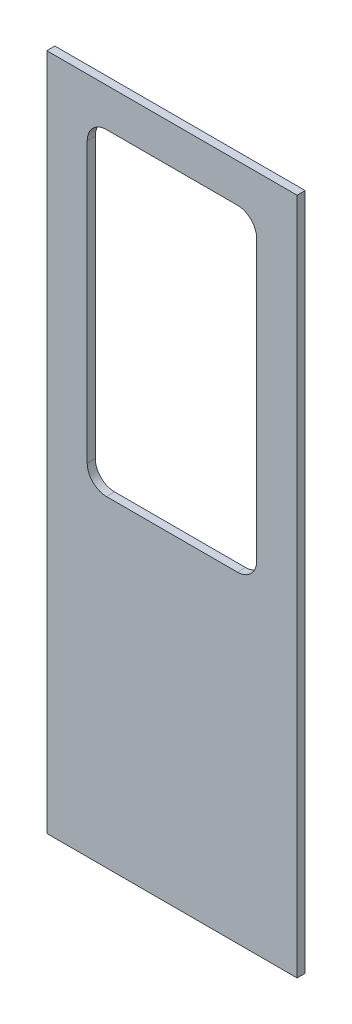
ISO-10303-21;
HEADER;
FILE_DESCRIPTION(('STEP AP214'),'2;1');
FILE_NAME('part.step','',(''),(''),'','','');
FILE_SCHEMA(('AUTOMOTIVE_DESIGN { 1 0 10303 214 1 1 1 1 }'));
ENDSEC;
DATA;
#1=APPLICATION_CONTEXT('core data for automotive mechanical design processes');
#2=APPLICATION_PROTOCOL_DEFINITION('international standard','automotive_design',2000,#1);
#3=PRODUCT_CONTEXT('',#1,'mechanical');
#4=PRODUCT('Part','Part','',(#3));
#5=PRODUCT_RELATED_PRODUCT_CATEGORY('part','',(#4));
#6=PRODUCT_DEFINITION_FORMATION('','',#4);
#7=PRODUCT_DEFINITION_CONTEXT('part definition',#1,'design');
#8=PRODUCT_DEFINITION('design','',#6,#7);
#9=PRODUCT_DEFINITION_SHAPE('','',#8);
#10=(LENGTH_UNIT() NAMED_UNIT(*) SI_UNIT(.MILLI.,.METRE.));
#11=(NAMED_UNIT(*) PLANE_ANGLE_UNIT() SI_UNIT($,.RADIAN.));
#12=(NAMED_UNIT(*) SI_UNIT($,.STERADIAN.) SOLID_ANGLE_UNIT());
#13=UNCERTAINTY_MEASURE_WITH_UNIT(LENGTH_MEASURE(1.E-05),#10,'distance_accuracy_value','');
#14=(GEOMETRIC_REPRESENTATION_CONTEXT(3) GLOBAL_UNCERTAINTY_ASSIGNED_CONTEXT((#13)) GLOBAL_UNIT_ASSIGNED_CONTEXT((#10,
#11,#12)) REPRESENTATION_CONTEXT('',''));
#15=CARTESIAN_POINT('',(0.,0.,0.));
#16=DIRECTION('',(0.,0.,1.));
#17=DIRECTION('',(1.,0.,0.));
#18=AXIS2_PLACEMENT_3D('',#15,#16,#17);
#19=CARTESIAN_POINT('',(0.,0.,2.667));
#20=DIRECTION('',(0.,0.,1.));
#21=DIRECTION('',(1.,0.,0.));
#22=AXIS2_PLACEMENT_3D('',#19,#20,#21);
#23=PLANE('',#22);
#24=DIRECTION('',(0.,-1.,0.));
#25=VECTOR('',#24,1.);
#26=CARTESIAN_POINT('',(-41.275,-111.76,2.667));
#27=LINE('',#26,#25);
#28=CARTESIAN_POINT('',(-41.275,111.76,2.667));
#29=VERTEX_POINT('',#28);
#30=CARTESIAN_POINT('',(-41.275,-111.76,2.667));
#31=VERTEX_POINT('',#30);
#32=EDGE_CURVE('E187',#29,#31,#27,.T.);
#33=ORIENTED_EDGE('',*,*,#32,.T.);
#34=DIRECTION('',(1.,0.,0.));
#35=VECTOR('',#34,1.);
#36=CARTESIAN_POINT('',(41.275,-111.76,2.667));
#37=LINE('',#36,#35);
#38=CARTESIAN_POINT('',(41.275,-111.76,2.667));
#39=VERTEX_POINT('',#38);
#40=EDGE_CURVE('E190',#31,#39,#37,.T.);
#41=ORIENTED_EDGE('',*,*,#40,.T.);
#42=DIRECTION('',(0.,1.,0.));
#43=VECTOR('',#42,1.);
#44=CARTESIAN_POINT('',(41.275,-111.76,2.667));
#45=LINE('',#44,#43);
#46=CARTESIAN_POINT('',(41.275,111.76,2.667));
#47=VERTEX_POINT('',#46);
#48=EDGE_CURVE('E193',#39,#47,#45,.T.);
#49=ORIENTED_EDGE('',*,*,#48,.T.);
#50=DIRECTION('',(-1.,0.,0.));
#51=VECTOR('',#50,1.);
#52=CARTESIAN_POINT('',(41.275,111.76,2.667));
#53=LINE('',#52,#51);
#54=EDGE_CURVE('E195',#47,#29,#53,.T.);
#55=ORIENTED_EDGE('',*,*,#54,.T.);
#56=EDGE_LOOP('',(#33,#41,#49,#55));
#57=FACE_BOUND('',#56,.T.);
#58=DIRECTION('',(-1.,0.,0.));
#59=VECTOR('',#58,1.);
#60=CARTESIAN_POINT('',(-21.59,99.06,2.667));
#61=LINE('',#60,#59);
#62=CARTESIAN_POINT('',(21.59,99.06,2.667));
#63=VERTEX_POINT('',#62);
#64=CARTESIAN_POINT('',(-21.59,99.06,2.667));
#65=VERTEX_POINT('',#64);
#66=EDGE_CURVE('E130',#63,#65,#61,.T.);
#67=ORIENTED_EDGE('',*,*,#66,.F.);
#68=CARTESIAN_POINT('',(21.59,92.71,2.667));
#69=DIRECTION('',(0.,0.,1.));
#70=DIRECTION('',(1.,0.,0.));
#71=AXIS2_PLACEMENT_3D('',#68,#69,#70);
#72=CIRCLE('',#71,6.35000000000001);
#73=CARTESIAN_POINT('',(27.94,92.71,2.667));
#74=VERTEX_POINT('',#73);
#75=EDGE_CURVE('E122',#74,#63,#72,.T.);
#76=ORIENTED_EDGE('',*,*,#75,.F.);
#77=DIRECTION('',(0.,1.,0.));
#78=VECTOR('',#77,1.);
#79=CARTESIAN_POINT('',(27.94,92.71,2.667));
#80=LINE('',#79,#78);
#81=CARTESIAN_POINT('',(27.94,0.634999999999989,2.667));
#82=VERTEX_POINT('',#81);
#83=EDGE_CURVE('E155',#82,#74,#80,.T.);
#84=ORIENTED_EDGE('',*,*,#83,.F.);
#85=CARTESIAN_POINT('',(21.59,0.634999999999988,2.667));
#86=DIRECTION('',(0.,0.,1.));
#87=DIRECTION('',(1.,0.,0.));
#88=AXIS2_PLACEMENT_3D('',#85,#86,#87);
#89=CIRCLE('',#88,6.35);
#90=CARTESIAN_POINT('',(21.59,-5.71500000000001,2.667));
#91=VERTEX_POINT('',#90);
#92=EDGE_CURVE('E153',#91,#82,#89,.T.);
#93=ORIENTED_EDGE('',*,*,#92,.F.);
#94=DIRECTION('',(1.,0.,0.));
#95=VECTOR('',#94,1.);
#96=CARTESIAN_POINT('',(-21.59,-5.71500000000002,2.667));
#97=LINE('',#96,#95);
#98=CARTESIAN_POINT('',(-21.59,-5.71500000000002,2.667));
#99=VERTEX_POINT('',#98);
#100=EDGE_CURVE('E151',#99,#91,#97,.T.);
#101=ORIENTED_EDGE('',*,*,#100,.F.);
#102=CARTESIAN_POINT('',(-21.59,0.634999999999983,2.667));
#103=DIRECTION('',(0.,0.,1.));
#104=DIRECTION('',(1.,0.,0.));
#105=AXIS2_PLACEMENT_3D('',#102,#103,#104);
#106=CIRCLE('',#105,6.35);
#107=CARTESIAN_POINT('',(-27.94,0.634999999999984,2.667));
#108=VERTEX_POINT('',#107);
#109=EDGE_CURVE('E149',#108,#99,#106,.T.);
#110=ORIENTED_EDGE('',*,*,#109,.F.);
#111=DIRECTION('',(0.,-1.,0.));
#112=VECTOR('',#111,1.);
#113=CARTESIAN_POINT('',(-27.94,92.71,2.667));
#114=LINE('',#113,#112);
#115=CARTESIAN_POINT('',(-27.94,92.71,2.667));
#116=VERTEX_POINT('',#115);
#117=EDGE_CURVE('E145',#116,#108,#114,.T.);
#118=ORIENTED_EDGE('',*,*,#117,.F.);
#119=CARTESIAN_POINT('',(-21.59,92.71,2.667));
#120=DIRECTION('',(0.,0.,1.));
#121=DIRECTION('',(1.,0.,0.));
#122=AXIS2_PLACEMENT_3D('',#119,#120,#121);
#123=CIRCLE('',#122,6.35000000000001);
#124=EDGE_CURVE('E143',#65,#116,#123,.T.);
#125=ORIENTED_EDGE('',*,*,#124,.F.);
#126=EDGE_LOOP('',(#67,#76,#84,#93,#101,#110,#118,#125));
#127=FACE_BOUND('',#126,.T.);
#128=ADVANCED_FACE('F33',(#57,#127),#23,.T.);
#129=CARTESIAN_POINT('',(0.,0.,0.));
#130=DIRECTION('',(0.,0.,1.));
#131=DIRECTION('',(1.,0.,0.));
#132=AXIS2_PLACEMENT_3D('',#129,#130,#131);
#133=PLANE('',#132);
#134=DIRECTION('',(0.,-1.,0.));
#135=VECTOR('',#134,1.);
#136=CARTESIAN_POINT('',(-41.275,-111.76,0.));
#137=LINE('',#136,#135);
#138=CARTESIAN_POINT('',(-41.275,111.76,0.));
#139=VERTEX_POINT('',#138);
#140=CARTESIAN_POINT('',(-41.275,-111.76,0.));
#141=VERTEX_POINT('',#140);
#142=EDGE_CURVE('E138',#139,#141,#137,.T.);
#143=ORIENTED_EDGE('',*,*,#142,.F.);
#144=DIRECTION('',(-1.,0.,0.));
#145=VECTOR('',#144,1.);
#146=CARTESIAN_POINT('',(41.275,111.76,0.));
#147=LINE('',#146,#145);
#148=CARTESIAN_POINT('',(41.275,111.76,0.));
#149=VERTEX_POINT('',#148);
#150=EDGE_CURVE('E191',#149,#139,#147,.T.);
#151=ORIENTED_EDGE('',*,*,#150,.F.);
#152=DIRECTION('',(0.,1.,0.));
#153=VECTOR('',#152,1.);
#154=CARTESIAN_POINT('',(41.275,-111.76,0.));
#155=LINE('',#154,#153);
#156=CARTESIAN_POINT('',(41.275,-111.76,0.));
#157=VERTEX_POINT('',#156);
#158=EDGE_CURVE('E202',#157,#149,#155,.T.);
#159=ORIENTED_EDGE('',*,*,#158,.F.);
#160=DIRECTION('',(1.,0.,0.));
#161=VECTOR('',#160,1.);
#162=CARTESIAN_POINT('',(41.275,-111.76,0.));
#163=LINE('',#162,#161);
#164=EDGE_CURVE('E200',#141,#157,#163,.T.);
#165=ORIENTED_EDGE('',*,*,#164,.F.);
#166=EDGE_LOOP('',(#143,#151,#159,#165));
#167=FACE_BOUND('',#166,.T.);
#168=CARTESIAN_POINT('',(21.59,92.71,0.));
#169=DIRECTION('',(0.,0.,1.));
#170=DIRECTION('',(1.,0.,0.));
#171=AXIS2_PLACEMENT_3D('',#168,#169,#170);
#172=CIRCLE('',#171,6.35000000000001);
#173=CARTESIAN_POINT('',(27.94,92.71,0.));
#174=VERTEX_POINT('',#173);
#175=CARTESIAN_POINT('',(21.59,99.06,0.));
#176=VERTEX_POINT('',#175);
#177=EDGE_CURVE('E56',#174,#176,#172,.T.);
#178=ORIENTED_EDGE('',*,*,#177,.T.);
#179=DIRECTION('',(-1.,0.,0.));
#180=VECTOR('',#179,1.);
#181=CARTESIAN_POINT('',(-21.59,99.06,0.));
#182=LINE('',#181,#180);
#183=CARTESIAN_POINT('',(-21.59,99.06,0.));
#184=VERTEX_POINT('',#183);
#185=EDGE_CURVE('E137',#176,#184,#182,.T.);
#186=ORIENTED_EDGE('',*,*,#185,.T.);
#187=CARTESIAN_POINT('',(-21.59,92.71,0.));
#188=DIRECTION('',(0.,0.,1.));
#189=DIRECTION('',(1.,0.,0.));
#190=AXIS2_PLACEMENT_3D('',#187,#188,#189);
#191=CIRCLE('',#190,6.35000000000001);
#192=CARTESIAN_POINT('',(-27.94,92.71,0.));
#193=VERTEX_POINT('',#192);
#194=EDGE_CURVE('E159',#184,#193,#191,.T.);
#195=ORIENTED_EDGE('',*,*,#194,.T.);
#196=DIRECTION('',(0.,-1.,0.));
#197=VECTOR('',#196,1.);
#198=CARTESIAN_POINT('',(-27.94,92.71,0.));
#199=LINE('',#198,#197);
#200=CARTESIAN_POINT('',(-27.94,0.634999999999984,0.));
#201=VERTEX_POINT('',#200);
#202=EDGE_CURVE('E162',#193,#201,#199,.T.);
#203=ORIENTED_EDGE('',*,*,#202,.T.);
#204=CARTESIAN_POINT('',(-21.59,0.634999999999983,0.));
#205=DIRECTION('',(0.,0.,1.));
#206=DIRECTION('',(1.,0.,0.));
#207=AXIS2_PLACEMENT_3D('',#204,#205,#206);
#208=CIRCLE('',#207,6.35);
#209=CARTESIAN_POINT('',(-21.59,-5.71500000000002,0.));
#210=VERTEX_POINT('',#209);
#211=EDGE_CURVE('E165',#201,#210,#208,.T.);
#212=ORIENTED_EDGE('',*,*,#211,.T.);
#213=DIRECTION('',(1.,0.,0.));
#214=VECTOR('',#213,1.);
#215=CARTESIAN_POINT('',(-21.59,-5.71500000000002,0.));
#216=LINE('',#215,#214);
#217=CARTESIAN_POINT('',(21.59,-5.71500000000001,0.));
#218=VERTEX_POINT('',#217);
#219=EDGE_CURVE('E168',#210,#218,#216,.T.);
#220=ORIENTED_EDGE('',*,*,#219,.T.);
#221=CARTESIAN_POINT('',(21.59,0.634999999999988,0.));
#222=DIRECTION('',(0.,0.,1.));
#223=DIRECTION('',(1.,0.,0.));
#224=AXIS2_PLACEMENT_3D('',#221,#222,#223);
#225=CIRCLE('',#224,6.35);
#226=CARTESIAN_POINT('',(27.94,0.634999999999989,0.));
#227=VERTEX_POINT('',#226);
#228=EDGE_CURVE('E171',#218,#227,#225,.T.);
#229=ORIENTED_EDGE('',*,*,#228,.T.);
#230=DIRECTION('',(0.,1.,0.));
#231=VECTOR('',#230,1.);
#232=CARTESIAN_POINT('',(27.94,92.71,0.));
#233=LINE('',#232,#231);
#234=EDGE_CURVE('E131',#227,#174,#233,.T.);
#235=ORIENTED_EDGE('',*,*,#234,.T.);
#236=EDGE_LOOP('',(#178,#186,#195,#203,#212,#220,#229,#235));
#237=FACE_BOUND('',#236,.T.);
#238=ADVANCED_FACE('F220',(#167,#237),#133,.F.);
#239=CARTESIAN_POINT('',(-41.275,-111.76,2.667));
#240=DIRECTION('',(1.,0.,0.));
#241=DIRECTION('',(0.,1.,0.));
#242=AXIS2_PLACEMENT_3D('',#239,#240,#241);
#243=PLANE('',#242);
#244=ORIENTED_EDGE('',*,*,#142,.T.);
#245=DIRECTION('',(0.,0.,-1.));
#246=VECTOR('',#245,1.);
#247=CARTESIAN_POINT('',(-41.275,-111.76,2.667));
#248=LINE('',#247,#246);
#249=EDGE_CURVE('E11',#31,#141,#248,.T.);
#250=ORIENTED_EDGE('',*,*,#249,.F.);
#251=ORIENTED_EDGE('',*,*,#32,.F.);
#252=DIRECTION('',(0.,0.,-1.));
#253=VECTOR('',#252,1.);
#254=CARTESIAN_POINT('',(-41.275,111.76,2.667));
#255=LINE('',#254,#253);
#256=EDGE_CURVE('E197',#29,#139,#255,.T.);
#257=ORIENTED_EDGE('',*,*,#256,.T.);
#258=EDGE_LOOP('',(#244,#250,#251,#257));
#259=FACE_BOUND('',#258,.T.);
#260=ADVANCED_FACE('F35',(#259),#243,.F.);
#261=CARTESIAN_POINT('',(41.275,-111.76,2.667));
#262=DIRECTION('',(0.,1.,0.));
#263=DIRECTION('',(-1.,0.,0.));
#264=AXIS2_PLACEMENT_3D('',#261,#262,#263);
#265=PLANE('',#264);
#266=ORIENTED_EDGE('',*,*,#164,.T.);
#267=DIRECTION('',(0.,0.,-1.));
#268=VECTOR('',#267,1.);
#269=CARTESIAN_POINT('',(41.275,-111.76,2.667));
#270=LINE('',#269,#268);
#271=EDGE_CURVE('E41',#39,#157,#270,.T.);
#272=ORIENTED_EDGE('',*,*,#271,.F.);
#273=ORIENTED_EDGE('',*,*,#40,.F.);
#274=ORIENTED_EDGE('',*,*,#249,.T.);
#275=EDGE_LOOP('',(#266,#272,#273,#274));
#276=FACE_BOUND('',#275,.T.);
#277=ADVANCED_FACE('F230',(#276),#265,.F.);
#278=CARTESIAN_POINT('',(41.275,-111.76,2.667));
#279=DIRECTION('',(-1.,0.,0.));
#280=DIRECTION('',(0.,-1.,0.));
#281=AXIS2_PLACEMENT_3D('',#278,#279,#280);
#282=PLANE('',#281);
#283=ORIENTED_EDGE('',*,*,#158,.T.);
#284=DIRECTION('',(0.,0.,-1.));
#285=VECTOR('',#284,1.);
#286=CARTESIAN_POINT('',(41.275,111.76,2.667));
#287=LINE('',#286,#285);
#288=EDGE_CURVE('E207',#47,#149,#287,.T.);
#289=ORIENTED_EDGE('',*,*,#288,.F.);
#290=ORIENTED_EDGE('',*,*,#48,.F.);
#291=ORIENTED_EDGE('',*,*,#271,.T.);
#292=EDGE_LOOP('',(#283,#289,#290,#291));
#293=FACE_BOUND('',#292,.T.);
#294=ADVANCED_FACE('F214',(#293),#282,.F.);
#295=CARTESIAN_POINT('',(41.275,111.76,2.667));
#296=DIRECTION('',(0.,-1.,0.));
#297=DIRECTION('',(1.,0.,0.));
#298=AXIS2_PLACEMENT_3D('',#295,#296,#297);
#299=PLANE('',#298);
#300=ORIENTED_EDGE('',*,*,#150,.T.);
#301=ORIENTED_EDGE('',*,*,#256,.F.);
#302=ORIENTED_EDGE('',*,*,#54,.F.);
#303=ORIENTED_EDGE('',*,*,#288,.T.);
#304=EDGE_LOOP('',(#300,#301,#302,#303));
#305=FACE_BOUND('',#304,.T.);
#306=ADVANCED_FACE('F224',(#305),#299,.F.);
#307=CARTESIAN_POINT('',(21.59,92.71,2.667));
#308=DIRECTION('',(0.,0.,-1.));
#309=DIRECTION('',(-1.,0.,0.));
#310=AXIS2_PLACEMENT_3D('',#307,#308,#309);
#311=CYLINDRICAL_SURFACE('',#310,6.35000000000001);
#312=ORIENTED_EDGE('',*,*,#177,.F.);
#313=DIRECTION('',(0.,0.,-1.));
#314=VECTOR('',#313,1.);
#315=CARTESIAN_POINT('',(27.94,92.71,2.667));
#316=LINE('',#315,#314);
#317=EDGE_CURVE('E126',#74,#174,#316,.T.);
#318=ORIENTED_EDGE('',*,*,#317,.F.);
#319=ORIENTED_EDGE('',*,*,#75,.T.);
#320=DIRECTION('',(0.,0.,-1.));
#321=VECTOR('',#320,1.);
#322=CARTESIAN_POINT('',(21.59,99.06,2.667));
#323=LINE('',#322,#321);
#324=EDGE_CURVE('E125',#63,#176,#323,.T.);
#325=ORIENTED_EDGE('',*,*,#324,.T.);
#326=EDGE_LOOP('',(#312,#318,#319,#325));
#327=FACE_BOUND('',#326,.T.);
#328=ADVANCED_FACE('F124',(#327),#311,.F.);
#329=CARTESIAN_POINT('',(-21.59,99.06,2.667));
#330=DIRECTION('',(0.,-1.,0.));
#331=DIRECTION('',(0.,0.,-1.));
#332=AXIS2_PLACEMENT_3D('',#329,#330,#331);
#333=PLANE('',#332);
#334=ORIENTED_EDGE('',*,*,#185,.F.);
#335=ORIENTED_EDGE('',*,*,#324,.F.);
#336=ORIENTED_EDGE('',*,*,#66,.T.);
#337=DIRECTION('',(0.,0.,-1.));
#338=VECTOR('',#337,1.);
#339=CARTESIAN_POINT('',(-21.59,99.06,2.667));
#340=LINE('',#339,#338);
#341=EDGE_CURVE('E139',#65,#184,#340,.T.);
#342=ORIENTED_EDGE('',*,*,#341,.T.);
#343=EDGE_LOOP('',(#334,#335,#336,#342));
#344=FACE_BOUND('',#343,.T.);
#345=ADVANCED_FACE('F134',(#344),#333,.T.);
#346=CARTESIAN_POINT('',(-21.59,92.71,2.667));
#347=DIRECTION('',(0.,0.,-1.));
#348=DIRECTION('',(-1.,0.,0.));
#349=AXIS2_PLACEMENT_3D('',#346,#347,#348);
#350=CYLINDRICAL_SURFACE('',#349,6.35000000000001);
#351=ORIENTED_EDGE('',*,*,#194,.F.);
#352=ORIENTED_EDGE('',*,*,#341,.F.);
#353=ORIENTED_EDGE('',*,*,#124,.T.);
#354=DIRECTION('',(0.,0.,-1.));
#355=VECTOR('',#354,1.);
#356=CARTESIAN_POINT('',(-27.94,92.71,2.667));
#357=LINE('',#356,#355);
#358=EDGE_CURVE('E184',#116,#193,#357,.T.);
#359=ORIENTED_EDGE('',*,*,#358,.T.);
#360=EDGE_LOOP('',(#351,#352,#353,#359));
#361=FACE_BOUND('',#360,.T.);
#362=ADVANCED_FACE('F253',(#361),#350,.F.);
#363=CARTESIAN_POINT('',(-27.94,92.71,2.667));
#364=DIRECTION('',(1.,0.,0.));
#365=DIRECTION('',(0.,1.,0.));
#366=AXIS2_PLACEMENT_3D('',#363,#364,#365);
#367=PLANE('',#366);
#368=ORIENTED_EDGE('',*,*,#202,.F.);
#369=ORIENTED_EDGE('',*,*,#358,.F.);
#370=ORIENTED_EDGE('',*,*,#117,.T.);
#371=DIRECTION('',(0.,0.,-1.));
#372=VECTOR('',#371,1.);
#373=CARTESIAN_POINT('',(-27.94,0.634999999999984,2.667));
#374=LINE('',#373,#372);
#375=EDGE_CURVE('E182',#108,#201,#374,.T.);
#376=ORIENTED_EDGE('',*,*,#375,.T.);
#377=EDGE_LOOP('',(#368,#369,#370,#376));
#378=FACE_BOUND('',#377,.T.);
#379=ADVANCED_FACE('F257',(#378),#367,.T.);
#380=CARTESIAN_POINT('',(-21.59,0.634999999999983,2.667));
#381=DIRECTION('',(0.,0.,-1.));
#382=DIRECTION('',(-1.,0.,0.));
#383=AXIS2_PLACEMENT_3D('',#380,#381,#382);
#384=CYLINDRICAL_SURFACE('',#383,6.35);
#385=ORIENTED_EDGE('',*,*,#211,.F.);
#386=ORIENTED_EDGE('',*,*,#375,.F.);
#387=ORIENTED_EDGE('',*,*,#109,.T.);
#388=DIRECTION('',(0.,0.,-1.));
#389=VECTOR('',#388,1.);
#390=CARTESIAN_POINT('',(-21.59,-5.71500000000002,2.667));
#391=LINE('',#390,#389);
#392=EDGE_CURVE('E180',#99,#210,#391,.T.);
#393=ORIENTED_EDGE('',*,*,#392,.T.);
#394=EDGE_LOOP('',(#385,#386,#387,#393));
#395=FACE_BOUND('',#394,.T.);
#396=ADVANCED_FACE('F263',(#395),#384,.F.);
#397=CARTESIAN_POINT('',(-21.59,-5.71500000000002,2.667));
#398=DIRECTION('',(0.,1.,0.));
#399=DIRECTION('',(-1.,0.,0.));
#400=AXIS2_PLACEMENT_3D('',#397,#398,#399);
#401=PLANE('',#400);
#402=ORIENTED_EDGE('',*,*,#219,.F.);
#403=ORIENTED_EDGE('',*,*,#392,.F.);
#404=ORIENTED_EDGE('',*,*,#100,.T.);
#405=DIRECTION('',(0.,0.,-1.));
#406=VECTOR('',#405,1.);
#407=CARTESIAN_POINT('',(21.59,-5.71500000000001,2.667));
#408=LINE('',#407,#406);
#409=EDGE_CURVE('E178',#91,#218,#408,.T.);
#410=ORIENTED_EDGE('',*,*,#409,.T.);
#411=EDGE_LOOP('',(#402,#403,#404,#410));
#412=FACE_BOUND('',#411,.T.);
#413=ADVANCED_FACE('F267',(#412),#401,.T.);
#414=CARTESIAN_POINT('',(21.59,0.634999999999988,2.667));
#415=DIRECTION('',(0.,0.,-1.));
#416=DIRECTION('',(-1.,0.,0.));
#417=AXIS2_PLACEMENT_3D('',#414,#415,#416);
#418=CYLINDRICAL_SURFACE('',#417,6.35);
#419=ORIENTED_EDGE('',*,*,#228,.F.);
#420=ORIENTED_EDGE('',*,*,#409,.F.);
#421=ORIENTED_EDGE('',*,*,#92,.T.);
#422=DIRECTION('',(0.,0.,-1.));
#423=VECTOR('',#422,1.);
#424=CARTESIAN_POINT('',(27.94,0.634999999999989,2.667));
#425=LINE('',#424,#423);
#426=EDGE_CURVE('E48',#82,#227,#425,.T.);
#427=ORIENTED_EDGE('',*,*,#426,.T.);
#428=EDGE_LOOP('',(#419,#420,#421,#427));
#429=FACE_BOUND('',#428,.T.);
#430=ADVANCED_FACE('F271',(#429),#418,.F.);
#431=CARTESIAN_POINT('',(27.94,92.71,2.667));
#432=DIRECTION('',(-1.,0.,0.));
#433=DIRECTION('',(0.,-1.,0.));
#434=AXIS2_PLACEMENT_3D('',#431,#432,#433);
#435=PLANE('',#434);
#436=ORIENTED_EDGE('',*,*,#234,.F.);
#437=ORIENTED_EDGE('',*,*,#426,.F.);
#438=ORIENTED_EDGE('',*,*,#83,.T.);
#439=ORIENTED_EDGE('',*,*,#317,.T.);
#440=EDGE_LOOP('',(#436,#437,#438,#439));
#441=FACE_BOUND('',#440,.T.);
#442=ADVANCED_FACE('F275',(#441),#435,.T.);
#443=CLOSED_SHELL('',(#128,#238,#260,#277,#294,#306,#328,#345,#362,#379,#396,#413,#430,#442));
#444=MANIFOLD_SOLID_BREP('B2',#443);
#445=ADVANCED_BREP_SHAPE_REPRESENTATION('',(#18,#444),#14);
#446=SHAPE_DEFINITION_REPRESENTATION(#9,#445);
ENDSEC;
END-ISO-10303-21;
